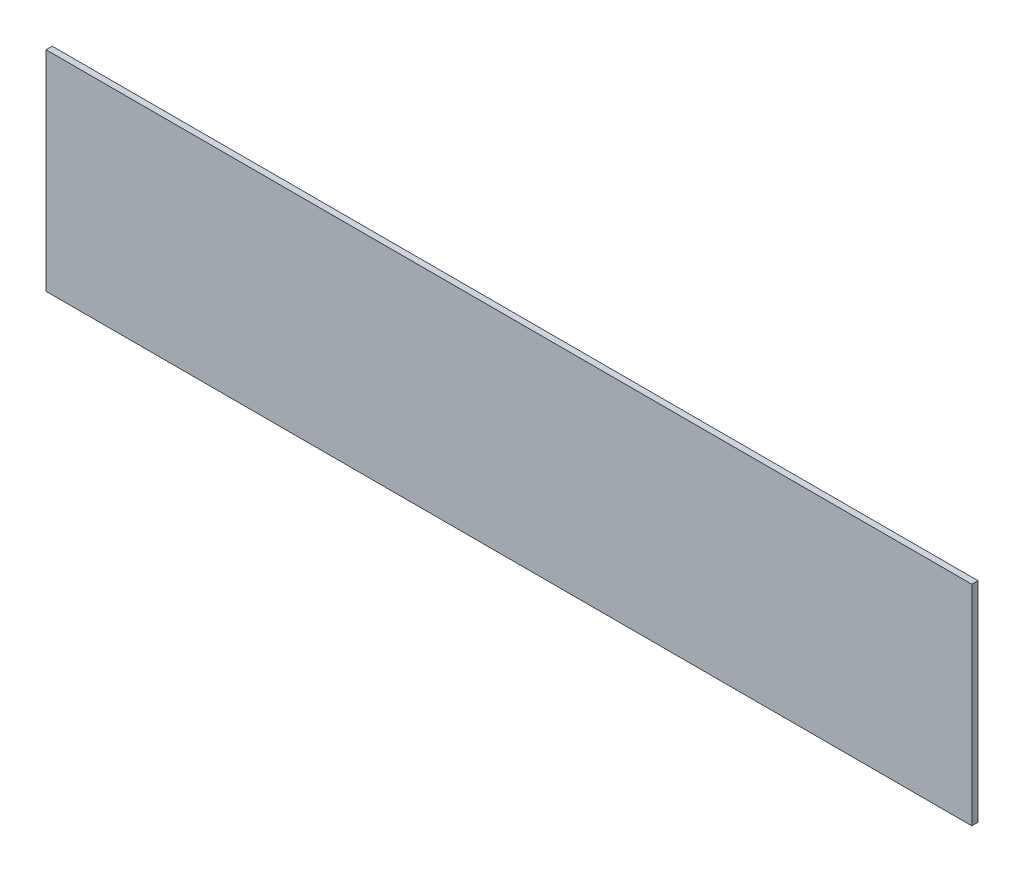
ISO-10303-21;
HEADER;
FILE_DESCRIPTION(('STEP AP214'),'2;1');
FILE_NAME('part.step','',(''),(''),'','','');
FILE_SCHEMA(('AUTOMOTIVE_DESIGN { 1 0 10303 214 1 1 1 1 }'));
ENDSEC;
DATA;
#1=APPLICATION_CONTEXT('core data for automotive mechanical design processes');
#2=APPLICATION_PROTOCOL_DEFINITION('international standard','automotive_design',2000,#1);
#3=PRODUCT_CONTEXT('',#1,'mechanical');
#4=PRODUCT('Part','Part','',(#3));
#5=PRODUCT_RELATED_PRODUCT_CATEGORY('part','',(#4));
#6=PRODUCT_DEFINITION_FORMATION('','',#4);
#7=PRODUCT_DEFINITION_CONTEXT('part definition',#1,'design');
#8=PRODUCT_DEFINITION('design','',#6,#7);
#9=PRODUCT_DEFINITION_SHAPE('','',#8);
#10=(LENGTH_UNIT() NAMED_UNIT(*) SI_UNIT(.MILLI.,.METRE.));
#11=(NAMED_UNIT(*) PLANE_ANGLE_UNIT() SI_UNIT($,.RADIAN.));
#12=(NAMED_UNIT(*) SI_UNIT($,.STERADIAN.) SOLID_ANGLE_UNIT());
#13=UNCERTAINTY_MEASURE_WITH_UNIT(LENGTH_MEASURE(1.E-05),#10,'distance_accuracy_value','');
#14=(GEOMETRIC_REPRESENTATION_CONTEXT(3) GLOBAL_UNCERTAINTY_ASSIGNED_CONTEXT((#13)) GLOBAL_UNIT_ASSIGNED_CONTEXT((#10,
#11,#12)) REPRESENTATION_CONTEXT('',''));
#15=CARTESIAN_POINT('',(0.,0.,0.));
#16=DIRECTION('',(0.,0.,1.));
#17=DIRECTION('',(1.,0.,0.));
#18=AXIS2_PLACEMENT_3D('',#15,#16,#17);
#19=CARTESIAN_POINT('',(-46.6125846249164,-26.6194417098174,1.27));
#20=DIRECTION('',(1.,0.,0.));
#21=DIRECTION('',(0.,0.,-1.));
#22=AXIS2_PLACEMENT_3D('',#19,#20,#21);
#23=PLANE('',#22);
#24=DIRECTION('',(0.,-1.,0.));
#25=VECTOR('',#24,1.);
#26=CARTESIAN_POINT('',(-46.6125846249164,-26.6194417098174,0.));
#27=LINE('',#26,#25);
#28=CARTESIAN_POINT('',(-46.6125846249164,16.4335582901826,0.));
#29=VERTEX_POINT('',#28);
#30=CARTESIAN_POINT('',(-46.6125846249164,-26.6194417098174,0.));
#31=VERTEX_POINT('',#30);
#32=EDGE_CURVE('E96',#29,#31,#27,.T.);
#33=ORIENTED_EDGE('',*,*,#32,.T.);
#34=DIRECTION('',(0.,0.,-1.));
#35=VECTOR('',#34,1.);
#36=CARTESIAN_POINT('',(-46.6125846249164,-26.6194417098174,1.27));
#37=LINE('',#36,#35);
#38=CARTESIAN_POINT('',(-46.6125846249164,-26.6194417098174,1.27));
#39=VERTEX_POINT('',#38);
#40=EDGE_CURVE('E11',#39,#31,#37,.T.);
#41=ORIENTED_EDGE('',*,*,#40,.F.);
#42=DIRECTION('',(0.,-1.,0.));
#43=VECTOR('',#42,1.);
#44=CARTESIAN_POINT('',(-46.6125846249164,-26.6194417098174,1.27));
#45=LINE('',#44,#43);
#46=CARTESIAN_POINT('',(-46.6125846249164,16.4335582901826,1.27));
#47=VERTEX_POINT('',#46);
#48=EDGE_CURVE('E84',#47,#39,#45,.T.);
#49=ORIENTED_EDGE('',*,*,#48,.F.);
#50=DIRECTION('',(0.,0.,-1.));
#51=VECTOR('',#50,1.);
#52=CARTESIAN_POINT('',(-46.6125846249164,16.4335582901826,1.27));
#53=LINE('',#52,#51);
#54=EDGE_CURVE('E92',#47,#29,#53,.T.);
#55=ORIENTED_EDGE('',*,*,#54,.T.);
#56=EDGE_LOOP('',(#33,#41,#49,#55));
#57=FACE_BOUND('',#56,.T.);
#58=ADVANCED_FACE('F33',(#57),#23,.F.);
#59=CARTESIAN_POINT('',(-46.6125846249164,-26.6194417098174,1.27));
#60=DIRECTION('',(0.,1.,0.));
#61=DIRECTION('',(0.,0.,1.));
#62=AXIS2_PLACEMENT_3D('',#59,#60,#61);
#63=PLANE('',#62);
#64=DIRECTION('',(1.,0.,0.));
#65=VECTOR('',#64,1.);
#66=CARTESIAN_POINT('',(-46.6125846249164,-26.6194417098174,0.));
#67=LINE('',#66,#65);
#68=CARTESIAN_POINT('',(143.887415375084,-26.6194417098174,0.));
#69=VERTEX_POINT('',#68);
#70=EDGE_CURVE('E88',#31,#69,#67,.T.);
#71=ORIENTED_EDGE('',*,*,#70,.T.);
#72=DIRECTION('',(0.,0.,-1.));
#73=VECTOR('',#72,1.);
#74=CARTESIAN_POINT('',(143.887415375084,-26.6194417098174,1.27));
#75=LINE('',#74,#73);
#76=CARTESIAN_POINT('',(143.887415375084,-26.6194417098174,1.27));
#77=VERTEX_POINT('',#76);
#78=EDGE_CURVE('E41',#77,#69,#75,.T.);
#79=ORIENTED_EDGE('',*,*,#78,.F.);
#80=DIRECTION('',(1.,0.,0.));
#81=VECTOR('',#80,1.);
#82=CARTESIAN_POINT('',(-46.6125846249164,-26.6194417098174,1.27));
#83=LINE('',#82,#81);
#84=EDGE_CURVE('E79',#39,#77,#83,.T.);
#85=ORIENTED_EDGE('',*,*,#84,.F.);
#86=ORIENTED_EDGE('',*,*,#40,.T.);
#87=EDGE_LOOP('',(#71,#79,#85,#86));
#88=FACE_BOUND('',#87,.T.);
#89=ADVANCED_FACE('F87',(#88),#63,.F.);
#90=CARTESIAN_POINT('',(143.887415375084,-26.6194417098174,1.27));
#91=DIRECTION('',(-1.,0.,0.));
#92=DIRECTION('',(0.,0.,1.));
#93=AXIS2_PLACEMENT_3D('',#90,#91,#92);
#94=PLANE('',#93);
#95=DIRECTION('',(0.,1.,0.));
#96=VECTOR('',#95,1.);
#97=CARTESIAN_POINT('',(143.887415375084,-26.6194417098174,0.));
#98=LINE('',#97,#96);
#99=CARTESIAN_POINT('',(143.887415375084,16.4335582901826,0.));
#100=VERTEX_POINT('',#99);
#101=EDGE_CURVE('E66',#69,#100,#98,.T.);
#102=ORIENTED_EDGE('',*,*,#101,.T.);
#103=DIRECTION('',(0.,0.,-1.));
#104=VECTOR('',#103,1.);
#105=CARTESIAN_POINT('',(143.887415375084,16.4335582901826,1.27));
#106=LINE('',#105,#104);
#107=CARTESIAN_POINT('',(143.887415375084,16.4335582901826,1.27));
#108=VERTEX_POINT('',#107);
#109=EDGE_CURVE('E89',#108,#100,#106,.T.);
#110=ORIENTED_EDGE('',*,*,#109,.F.);
#111=DIRECTION('',(0.,1.,0.));
#112=VECTOR('',#111,1.);
#113=CARTESIAN_POINT('',(143.887415375084,-26.6194417098174,1.27));
#114=LINE('',#113,#112);
#115=EDGE_CURVE('E82',#77,#108,#114,.T.);
#116=ORIENTED_EDGE('',*,*,#115,.F.);
#117=ORIENTED_EDGE('',*,*,#78,.T.);
#118=EDGE_LOOP('',(#102,#110,#116,#117));
#119=FACE_BOUND('',#118,.T.);
#120=ADVANCED_FACE('F90',(#119),#94,.F.);
#121=CARTESIAN_POINT('',(-46.6125846249164,16.4335582901826,1.27));
#122=DIRECTION('',(0.,-1.,0.));
#123=DIRECTION('',(0.,0.,-1.));
#124=AXIS2_PLACEMENT_3D('',#121,#122,#123);
#125=PLANE('',#124);
#126=DIRECTION('',(-1.,0.,0.));
#127=VECTOR('',#126,1.);
#128=CARTESIAN_POINT('',(-46.6125846249164,16.4335582901826,0.));
#129=LINE('',#128,#127);
#130=EDGE_CURVE('E72',#100,#29,#129,.T.);
#131=ORIENTED_EDGE('',*,*,#130,.T.);
#132=ORIENTED_EDGE('',*,*,#54,.F.);
#133=DIRECTION('',(-1.,0.,0.));
#134=VECTOR('',#133,1.);
#135=CARTESIAN_POINT('',(-46.6125846249164,16.4335582901826,1.27));
#136=LINE('',#135,#134);
#137=EDGE_CURVE('E49',#108,#47,#136,.T.);
#138=ORIENTED_EDGE('',*,*,#137,.F.);
#139=ORIENTED_EDGE('',*,*,#109,.T.);
#140=EDGE_LOOP('',(#131,#132,#138,#139));
#141=FACE_BOUND('',#140,.T.);
#142=ADVANCED_FACE('F103',(#141),#125,.F.);
#143=CARTESIAN_POINT('',(0.,0.,1.27));
#144=DIRECTION('',(0.,0.,-1.));
#145=DIRECTION('',(-1.,0.,0.));
#146=AXIS2_PLACEMENT_3D('',#143,#144,#145);
#147=PLANE('',#146);
#148=ORIENTED_EDGE('',*,*,#48,.T.);
#149=ORIENTED_EDGE('',*,*,#84,.T.);
#150=ORIENTED_EDGE('',*,*,#115,.T.);
#151=ORIENTED_EDGE('',*,*,#137,.T.);
#152=EDGE_LOOP('',(#148,#149,#150,#151));
#153=FACE_BOUND('',#152,.T.);
#154=ADVANCED_FACE('F80',(#153),#147,.F.);
#155=CARTESIAN_POINT('',(0.,0.,0.));
#156=DIRECTION('',(0.,0.,-1.));
#157=DIRECTION('',(-1.,0.,0.));
#158=AXIS2_PLACEMENT_3D('',#155,#156,#157);
#159=PLANE('',#158);
#160=ORIENTED_EDGE('',*,*,#32,.F.);
#161=ORIENTED_EDGE('',*,*,#130,.F.);
#162=ORIENTED_EDGE('',*,*,#101,.F.);
#163=ORIENTED_EDGE('',*,*,#70,.F.);
#164=EDGE_LOOP('',(#160,#161,#162,#163));
#165=FACE_BOUND('',#164,.T.);
#166=ADVANCED_FACE('F106',(#165),#159,.T.);
#167=CLOSED_SHELL('',(#58,#89,#120,#142,#154,#166));
#168=MANIFOLD_SOLID_BREP('B2',#167);
#169=ADVANCED_BREP_SHAPE_REPRESENTATION('',(#18,#168),#14);
#170=SHAPE_DEFINITION_REPRESENTATION(#9,#169);
ENDSEC;
END-ISO-10303-21;
